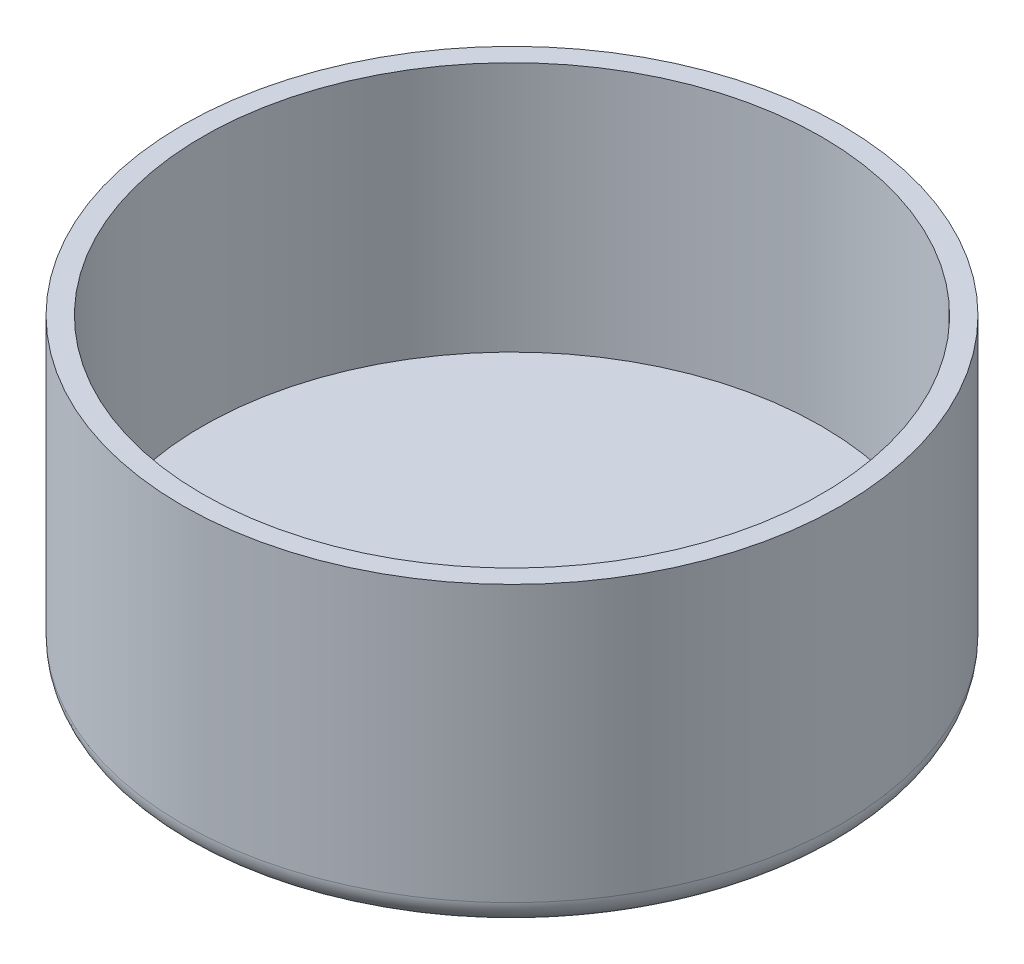
ISO-10303-21;
HEADER;
FILE_DESCRIPTION(('STEP AP214'),'2;1');
FILE_NAME('part.step','',(''),(''),'','','');
FILE_SCHEMA(('AUTOMOTIVE_DESIGN { 1 0 10303 214 1 1 1 1 }'));
ENDSEC;
DATA;
#1=APPLICATION_CONTEXT('core data for automotive mechanical design processes');
#2=APPLICATION_PROTOCOL_DEFINITION('international standard','automotive_design',2000,#1);
#3=PRODUCT_CONTEXT('',#1,'mechanical');
#4=PRODUCT('Part','Part','',(#3));
#5=PRODUCT_RELATED_PRODUCT_CATEGORY('part','',(#4));
#6=PRODUCT_DEFINITION_FORMATION('','',#4);
#7=PRODUCT_DEFINITION_CONTEXT('part definition',#1,'design');
#8=PRODUCT_DEFINITION('design','',#6,#7);
#9=PRODUCT_DEFINITION_SHAPE('','',#8);
#10=(LENGTH_UNIT() NAMED_UNIT(*) SI_UNIT(.MILLI.,.METRE.));
#11=(NAMED_UNIT(*) PLANE_ANGLE_UNIT() SI_UNIT($,.RADIAN.));
#12=(NAMED_UNIT(*) SI_UNIT($,.STERADIAN.) SOLID_ANGLE_UNIT());
#13=UNCERTAINTY_MEASURE_WITH_UNIT(LENGTH_MEASURE(1.E-05),#10,'distance_accuracy_value','');
#14=(GEOMETRIC_REPRESENTATION_CONTEXT(3) GLOBAL_UNCERTAINTY_ASSIGNED_CONTEXT((#13)) GLOBAL_UNIT_ASSIGNED_CONTEXT((#10,
#11,#12)) REPRESENTATION_CONTEXT('',''));
#15=CARTESIAN_POINT('',(0.,0.,0.));
#16=DIRECTION('',(0.,0.,1.));
#17=DIRECTION('',(1.,0.,0.));
#18=AXIS2_PLACEMENT_3D('',#15,#16,#17);
#19=CARTESIAN_POINT('',(0.,2.,0.));
#20=DIRECTION('',(0.,-1.,0.));
#21=DIRECTION('',(0.,0.,-1.));
#22=AXIS2_PLACEMENT_3D('',#19,#20,#21);
#23=CYLINDRICAL_SURFACE('',#22,13.15);
#24=CARTESIAN_POINT('',(0.,1.,0.));
#25=DIRECTION('',(0.,1.,0.));
#26=DIRECTION('',(0.,0.,1.));
#27=AXIS2_PLACEMENT_3D('',#24,#25,#26);
#28=CIRCLE('',#27,13.15);
#29=CARTESIAN_POINT('',(0.,1.,13.15));
#30=VERTEX_POINT('',#29);
#31=EDGE_CURVE('E38',#30,#30,#28,.T.);
#32=ORIENTED_EDGE('',*,*,#31,.T.);
#33=EDGE_LOOP('',(#32));
#34=FACE_BOUND('',#33,.T.);
#35=CARTESIAN_POINT('',(0.,12.,0.));
#36=DIRECTION('',(0.,1.,0.));
#37=DIRECTION('',(0.,0.,1.));
#38=AXIS2_PLACEMENT_3D('',#35,#36,#37);
#39=CIRCLE('',#38,13.15);
#40=CARTESIAN_POINT('',(0.,12.,13.15));
#41=VERTEX_POINT('',#40);
#42=EDGE_CURVE('E46',#41,#41,#39,.T.);
#43=ORIENTED_EDGE('',*,*,#42,.F.);
#44=EDGE_LOOP('',(#43));
#45=FACE_BOUND('',#44,.T.);
#46=ADVANCED_FACE('F31',(#34,#45),#23,.T.);
#47=CARTESIAN_POINT('',(0.,0.,0.));
#48=DIRECTION('',(0.,1.,0.));
#49=DIRECTION('',(0.,0.,1.));
#50=AXIS2_PLACEMENT_3D('',#47,#48,#49);
#51=PLANE('',#50);
#52=CARTESIAN_POINT('',(0.,0.,0.));
#53=DIRECTION('',(0.,1.,0.));
#54=DIRECTION('',(0.,0.,1.));
#55=AXIS2_PLACEMENT_3D('',#52,#53,#54);
#56=CIRCLE('',#55,12.15);
#57=CARTESIAN_POINT('',(0.,0.,12.15));
#58=VERTEX_POINT('',#57);
#59=EDGE_CURVE('E10',#58,#58,#56,.F.);
#60=ORIENTED_EDGE('',*,*,#59,.T.);
#61=EDGE_LOOP('',(#60));
#62=FACE_BOUND('',#61,.T.);
#63=ADVANCED_FACE('F60',(#62),#51,.F.);
#64=CARTESIAN_POINT('',(0.,12.,0.));
#65=DIRECTION('',(0.,1.,0.));
#66=DIRECTION('',(0.,0.,1.));
#67=AXIS2_PLACEMENT_3D('',#64,#65,#66);
#68=PLANE('',#67);
#69=ORIENTED_EDGE('',*,*,#42,.T.);
#70=EDGE_LOOP('',(#69));
#71=FACE_BOUND('',#70,.T.);
#72=CARTESIAN_POINT('',(0.,12.,0.));
#73=DIRECTION('',(0.,1.,0.));
#74=DIRECTION('',(0.,0.,1.));
#75=AXIS2_PLACEMENT_3D('',#72,#73,#74);
#76=CIRCLE('',#75,12.35);
#77=CARTESIAN_POINT('',(0.,12.,12.35));
#78=VERTEX_POINT('',#77);
#79=EDGE_CURVE('E51',#78,#78,#76,.T.);
#80=ORIENTED_EDGE('',*,*,#79,.F.);
#81=EDGE_LOOP('',(#80));
#82=FACE_BOUND('',#81,.T.);
#83=ADVANCED_FACE('F58',(#71,#82),#68,.T.);
#84=CARTESIAN_POINT('',(0.,12.,0.));
#85=DIRECTION('',(0.,-1.,0.));
#86=DIRECTION('',(0.,0.,-1.));
#87=AXIS2_PLACEMENT_3D('',#84,#85,#86);
#88=CYLINDRICAL_SURFACE('',#87,12.35);
#89=ORIENTED_EDGE('',*,*,#79,.T.);
#90=EDGE_LOOP('',(#89));
#91=FACE_BOUND('',#90,.T.);
#92=CARTESIAN_POINT('',(0.,2.,0.));
#93=DIRECTION('',(0.,1.,0.));
#94=DIRECTION('',(0.,0.,1.));
#95=AXIS2_PLACEMENT_3D('',#92,#93,#94);
#96=CIRCLE('',#95,12.35);
#97=CARTESIAN_POINT('',(0.,2.,12.35));
#98=VERTEX_POINT('',#97);
#99=EDGE_CURVE('E42',#98,#98,#96,.F.);
#100=ORIENTED_EDGE('',*,*,#99,.T.);
#101=EDGE_LOOP('',(#100));
#102=FACE_BOUND('',#101,.T.);
#103=ADVANCED_FACE('F55',(#91,#102),#88,.F.);
#104=CARTESIAN_POINT('',(0.,2.,0.));
#105=DIRECTION('',(0.,1.,0.));
#106=DIRECTION('',(0.,0.,1.));
#107=AXIS2_PLACEMENT_3D('',#104,#105,#106);
#108=PLANE('',#107);
#109=ORIENTED_EDGE('',*,*,#99,.F.);
#110=EDGE_LOOP('',(#109));
#111=FACE_BOUND('',#110,.T.);
#112=ADVANCED_FACE('F67',(#111),#108,.T.);
#113=CARTESIAN_POINT('',(0.,1.,0.));
#114=DIRECTION('',(0.,1.,0.));
#115=DIRECTION('',(0.,0.,1.));
#116=AXIS2_PLACEMENT_3D('',#113,#114,#115);
#117=TOROIDAL_SURFACE('',#116,12.15,1.);
#118=ORIENTED_EDGE('',*,*,#59,.F.);
#119=EDGE_LOOP('',(#118));
#120=FACE_BOUND('',#119,.T.);
#121=ORIENTED_EDGE('',*,*,#31,.F.);
#122=EDGE_LOOP('',(#121));
#123=FACE_BOUND('',#122,.T.);
#124=ADVANCED_FACE('F33',(#120,#123),#117,.T.);
#125=CLOSED_SHELL('',(#46,#63,#83,#103,#112,#124));
#126=MANIFOLD_SOLID_BREP('B2',#125);
#127=ADVANCED_BREP_SHAPE_REPRESENTATION('',(#18,#126),#14);
#128=SHAPE_DEFINITION_REPRESENTATION(#9,#127);
ENDSEC;
END-ISO-10303-21;
